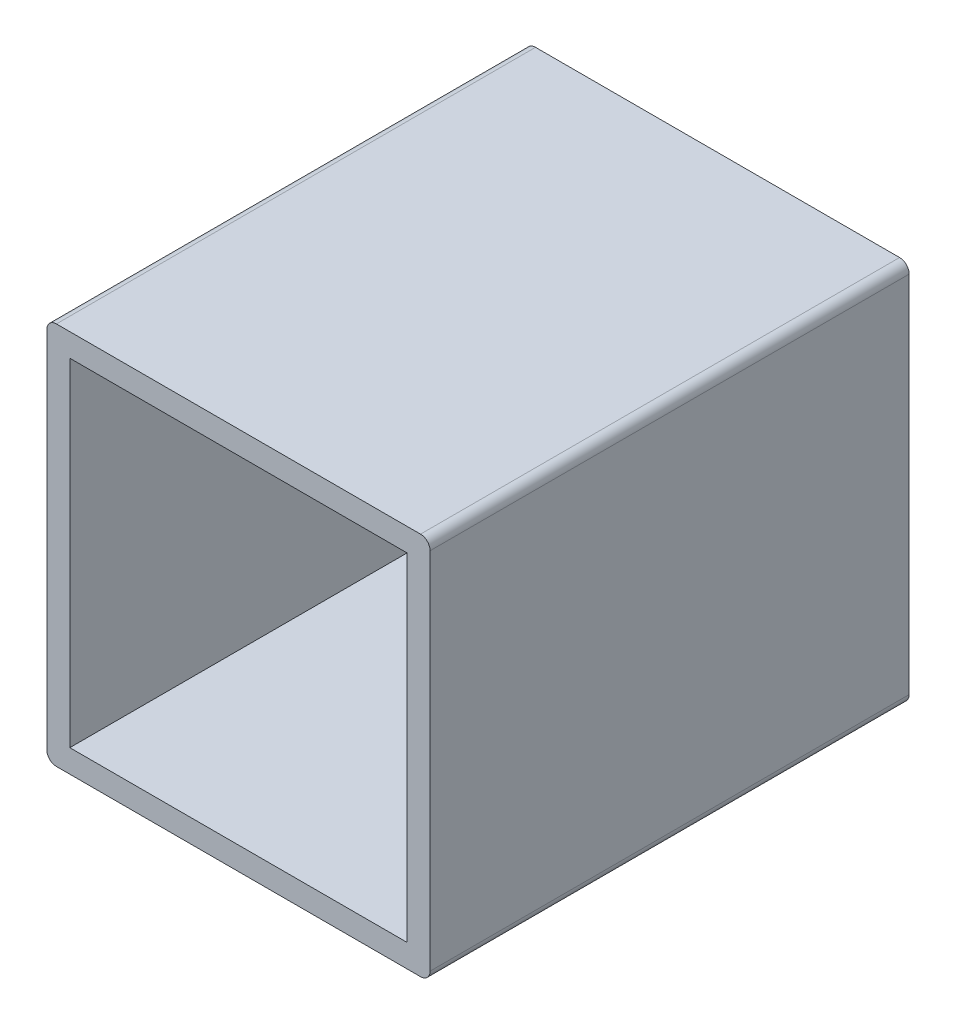
ISO-10303-21;
HEADER;
FILE_DESCRIPTION(('STEP AP214'),'2;1');
FILE_NAME('part.step','',(''),(''),'','','');
FILE_SCHEMA(('AUTOMOTIVE_DESIGN { 1 0 10303 214 1 1 1 1 }'));
ENDSEC;
DATA;
#1=APPLICATION_CONTEXT('core data for automotive mechanical design processes');
#2=APPLICATION_PROTOCOL_DEFINITION('international standard','automotive_design',2000,#1);
#3=PRODUCT_CONTEXT('',#1,'mechanical');
#4=PRODUCT('Part','Part','',(#3));
#5=PRODUCT_RELATED_PRODUCT_CATEGORY('part','',(#4));
#6=PRODUCT_DEFINITION_FORMATION('','',#4);
#7=PRODUCT_DEFINITION_CONTEXT('part definition',#1,'design');
#8=PRODUCT_DEFINITION('design','',#6,#7);
#9=PRODUCT_DEFINITION_SHAPE('','',#8);
#10=(LENGTH_UNIT() NAMED_UNIT(*) SI_UNIT(.MILLI.,.METRE.));
#11=(NAMED_UNIT(*) PLANE_ANGLE_UNIT() SI_UNIT($,.RADIAN.));
#12=(NAMED_UNIT(*) SI_UNIT($,.STERADIAN.) SOLID_ANGLE_UNIT());
#13=UNCERTAINTY_MEASURE_WITH_UNIT(LENGTH_MEASURE(1.E-05),#10,'distance_accuracy_value','');
#14=(GEOMETRIC_REPRESENTATION_CONTEXT(3) GLOBAL_UNCERTAINTY_ASSIGNED_CONTEXT((#13)) GLOBAL_UNIT_ASSIGNED_CONTEXT((#10,
#11,#12)) REPRESENTATION_CONTEXT('',''));
#15=CARTESIAN_POINT('',(0.,0.,0.));
#16=DIRECTION('',(0.,0.,1.));
#17=DIRECTION('',(1.,0.,0.));
#18=AXIS2_PLACEMENT_3D('',#15,#16,#17);
#19=CARTESIAN_POINT('',(-38.,-38.,-50.));
#20=DIRECTION('',(0.,0.,1.));
#21=DIRECTION('',(1.,0.,0.));
#22=AXIS2_PLACEMENT_3D('',#19,#20,#21);
#23=CYLINDRICAL_SURFACE('',#22,2.);
#24=CARTESIAN_POINT('',(-38.,-38.,50.));
#25=DIRECTION('',(0.,0.,1.));
#26=DIRECTION('',(1.,0.,0.));
#27=AXIS2_PLACEMENT_3D('',#24,#25,#26);
#28=CIRCLE('',#27,2.);
#29=CARTESIAN_POINT('',(-40.,-38.,50.));
#30=VERTEX_POINT('',#29);
#31=CARTESIAN_POINT('',(-38.,-40.,50.));
#32=VERTEX_POINT('',#31);
#33=EDGE_CURVE('E161',#30,#32,#28,.T.);
#34=ORIENTED_EDGE('',*,*,#33,.F.);
#35=DIRECTION('',(0.,0.,1.));
#36=VECTOR('',#35,1.);
#37=CARTESIAN_POINT('',(-40.,-38.,-50.));
#38=LINE('',#37,#36);
#39=CARTESIAN_POINT('',(-40.,-38.,-50.));
#40=VERTEX_POINT('',#39);
#41=EDGE_CURVE('E11',#40,#30,#38,.T.);
#42=ORIENTED_EDGE('',*,*,#41,.F.);
#43=CARTESIAN_POINT('',(-38.,-38.,-50.));
#44=DIRECTION('',(0.,0.,1.));
#45=DIRECTION('',(1.,0.,0.));
#46=AXIS2_PLACEMENT_3D('',#43,#44,#45);
#47=CIRCLE('',#46,2.);
#48=CARTESIAN_POINT('',(-38.,-40.,-50.));
#49=VERTEX_POINT('',#48);
#50=EDGE_CURVE('E165',#40,#49,#47,.T.);
#51=ORIENTED_EDGE('',*,*,#50,.T.);
#52=DIRECTION('',(0.,0.,1.));
#53=VECTOR('',#52,1.);
#54=CARTESIAN_POINT('',(-38.,-40.,-50.));
#55=LINE('',#54,#53);
#56=EDGE_CURVE('E42',#49,#32,#55,.T.);
#57=ORIENTED_EDGE('',*,*,#56,.T.);
#58=EDGE_LOOP('',(#34,#42,#51,#57));
#59=FACE_BOUND('',#58,.T.);
#60=ADVANCED_FACE('F39',(#59),#23,.T.);
#61=CARTESIAN_POINT('',(-40.,-38.,-50.));
#62=DIRECTION('',(-1.,0.,0.));
#63=DIRECTION('',(0.,0.,1.));
#64=AXIS2_PLACEMENT_3D('',#61,#62,#63);
#65=PLANE('',#64);
#66=DIRECTION('',(0.,-1.,0.));
#67=VECTOR('',#66,1.);
#68=CARTESIAN_POINT('',(-40.,-38.,50.));
#69=LINE('',#68,#67);
#70=CARTESIAN_POINT('',(-40.,38.,50.));
#71=VERTEX_POINT('',#70);
#72=EDGE_CURVE('E169',#71,#30,#69,.T.);
#73=ORIENTED_EDGE('',*,*,#72,.F.);
#74=DIRECTION('',(0.,0.,1.));
#75=VECTOR('',#74,1.);
#76=CARTESIAN_POINT('',(-40.,38.,-50.));
#77=LINE('',#76,#75);
#78=CARTESIAN_POINT('',(-40.,38.,-50.));
#79=VERTEX_POINT('',#78);
#80=EDGE_CURVE('E47',#79,#71,#77,.T.);
#81=ORIENTED_EDGE('',*,*,#80,.F.);
#82=DIRECTION('',(0.,-1.,0.));
#83=VECTOR('',#82,1.);
#84=CARTESIAN_POINT('',(-40.,-38.,-50.));
#85=LINE('',#84,#83);
#86=EDGE_CURVE('E187',#79,#40,#85,.T.);
#87=ORIENTED_EDGE('',*,*,#86,.T.);
#88=ORIENTED_EDGE('',*,*,#41,.T.);
#89=EDGE_LOOP('',(#73,#81,#87,#88));
#90=FACE_BOUND('',#89,.T.);
#91=ADVANCED_FACE('F234',(#90),#65,.T.);
#92=CARTESIAN_POINT('',(-38.,38.,-50.));
#93=DIRECTION('',(0.,0.,1.));
#94=DIRECTION('',(1.,0.,0.));
#95=AXIS2_PLACEMENT_3D('',#92,#93,#94);
#96=CYLINDRICAL_SURFACE('',#95,2.);
#97=CARTESIAN_POINT('',(-38.,38.,50.));
#98=DIRECTION('',(0.,0.,1.));
#99=DIRECTION('',(1.,0.,0.));
#100=AXIS2_PLACEMENT_3D('',#97,#98,#99);
#101=CIRCLE('',#100,2.);
#102=CARTESIAN_POINT('',(-38.,40.,50.));
#103=VERTEX_POINT('',#102);
#104=EDGE_CURVE('E207',#103,#71,#101,.T.);
#105=ORIENTED_EDGE('',*,*,#104,.F.);
#106=DIRECTION('',(0.,0.,1.));
#107=VECTOR('',#106,1.);
#108=CARTESIAN_POINT('',(-38.,40.,-50.));
#109=LINE('',#108,#107);
#110=CARTESIAN_POINT('',(-38.,40.,-50.));
#111=VERTEX_POINT('',#110);
#112=EDGE_CURVE('E213',#111,#103,#109,.T.);
#113=ORIENTED_EDGE('',*,*,#112,.F.);
#114=CARTESIAN_POINT('',(-38.,38.,-50.));
#115=DIRECTION('',(0.,0.,1.));
#116=DIRECTION('',(1.,0.,0.));
#117=AXIS2_PLACEMENT_3D('',#114,#115,#116);
#118=CIRCLE('',#117,2.);
#119=EDGE_CURVE('E184',#111,#79,#118,.T.);
#120=ORIENTED_EDGE('',*,*,#119,.T.);
#121=ORIENTED_EDGE('',*,*,#80,.T.);
#122=EDGE_LOOP('',(#105,#113,#120,#121));
#123=FACE_BOUND('',#122,.T.);
#124=ADVANCED_FACE('F253',(#123),#96,.T.);
#125=CARTESIAN_POINT('',(-38.,40.,-50.));
#126=DIRECTION('',(0.,1.,0.));
#127=DIRECTION('',(0.,0.,1.));
#128=AXIS2_PLACEMENT_3D('',#125,#126,#127);
#129=PLANE('',#128);
#130=DIRECTION('',(-1.,0.,0.));
#131=VECTOR('',#130,1.);
#132=CARTESIAN_POINT('',(-38.,40.,50.));
#133=LINE('',#132,#131);
#134=CARTESIAN_POINT('',(38.,40.,50.));
#135=VERTEX_POINT('',#134);
#136=EDGE_CURVE('E204',#135,#103,#133,.T.);
#137=ORIENTED_EDGE('',*,*,#136,.F.);
#138=DIRECTION('',(0.,0.,1.));
#139=VECTOR('',#138,1.);
#140=CARTESIAN_POINT('',(38.,40.,-50.));
#141=LINE('',#140,#139);
#142=CARTESIAN_POINT('',(38.,40.,-50.));
#143=VERTEX_POINT('',#142);
#144=EDGE_CURVE('E215',#143,#135,#141,.T.);
#145=ORIENTED_EDGE('',*,*,#144,.F.);
#146=DIRECTION('',(-1.,0.,0.));
#147=VECTOR('',#146,1.);
#148=CARTESIAN_POINT('',(-38.,40.,-50.));
#149=LINE('',#148,#147);
#150=EDGE_CURVE('E181',#143,#111,#149,.T.);
#151=ORIENTED_EDGE('',*,*,#150,.T.);
#152=ORIENTED_EDGE('',*,*,#112,.T.);
#153=EDGE_LOOP('',(#137,#145,#151,#152));
#154=FACE_BOUND('',#153,.T.);
#155=ADVANCED_FACE('F251',(#154),#129,.T.);
#156=CARTESIAN_POINT('',(38.,38.,-50.));
#157=DIRECTION('',(0.,0.,1.));
#158=DIRECTION('',(1.,0.,0.));
#159=AXIS2_PLACEMENT_3D('',#156,#157,#158);
#160=CYLINDRICAL_SURFACE('',#159,2.);
#161=CARTESIAN_POINT('',(38.,38.,50.));
#162=DIRECTION('',(0.,0.,1.));
#163=DIRECTION('',(-1.,0.,0.));
#164=AXIS2_PLACEMENT_3D('',#161,#162,#163);
#165=CIRCLE('',#164,2.);
#166=CARTESIAN_POINT('',(40.,38.,50.));
#167=VERTEX_POINT('',#166);
#168=EDGE_CURVE('E201',#167,#135,#165,.T.);
#169=ORIENTED_EDGE('',*,*,#168,.F.);
#170=DIRECTION('',(0.,0.,1.));
#171=VECTOR('',#170,1.);
#172=CARTESIAN_POINT('',(40.,38.,-50.));
#173=LINE('',#172,#171);
#174=CARTESIAN_POINT('',(40.,38.,-50.));
#175=VERTEX_POINT('',#174);
#176=EDGE_CURVE('E217',#175,#167,#173,.T.);
#177=ORIENTED_EDGE('',*,*,#176,.F.);
#178=CARTESIAN_POINT('',(38.,38.,-50.));
#179=DIRECTION('',(0.,0.,1.));
#180=DIRECTION('',(-1.,0.,0.));
#181=AXIS2_PLACEMENT_3D('',#178,#179,#180);
#182=CIRCLE('',#181,2.);
#183=EDGE_CURVE('E178',#175,#143,#182,.T.);
#184=ORIENTED_EDGE('',*,*,#183,.T.);
#185=ORIENTED_EDGE('',*,*,#144,.T.);
#186=EDGE_LOOP('',(#169,#177,#184,#185));
#187=FACE_BOUND('',#186,.T.);
#188=ADVANCED_FACE('F247',(#187),#160,.T.);
#189=CARTESIAN_POINT('',(40.,-38.,-50.));
#190=DIRECTION('',(1.,0.,0.));
#191=DIRECTION('',(0.,0.,-1.));
#192=AXIS2_PLACEMENT_3D('',#189,#190,#191);
#193=PLANE('',#192);
#194=DIRECTION('',(0.,1.,0.));
#195=VECTOR('',#194,1.);
#196=CARTESIAN_POINT('',(40.,-38.,50.));
#197=LINE('',#196,#195);
#198=CARTESIAN_POINT('',(40.,-38.,50.));
#199=VERTEX_POINT('',#198);
#200=EDGE_CURVE('E198',#199,#167,#197,.T.);
#201=ORIENTED_EDGE('',*,*,#200,.F.);
#202=DIRECTION('',(0.,0.,1.));
#203=VECTOR('',#202,1.);
#204=CARTESIAN_POINT('',(40.,-38.,-50.));
#205=LINE('',#204,#203);
#206=CARTESIAN_POINT('',(40.,-38.,-50.));
#207=VERTEX_POINT('',#206);
#208=EDGE_CURVE('E219',#207,#199,#205,.T.);
#209=ORIENTED_EDGE('',*,*,#208,.F.);
#210=DIRECTION('',(0.,1.,0.));
#211=VECTOR('',#210,1.);
#212=CARTESIAN_POINT('',(40.,-38.,-50.));
#213=LINE('',#212,#211);
#214=EDGE_CURVE('E175',#207,#175,#213,.T.);
#215=ORIENTED_EDGE('',*,*,#214,.T.);
#216=ORIENTED_EDGE('',*,*,#176,.T.);
#217=EDGE_LOOP('',(#201,#209,#215,#216));
#218=FACE_BOUND('',#217,.T.);
#219=ADVANCED_FACE('F245',(#218),#193,.T.);
#220=CARTESIAN_POINT('',(38.,-38.,-50.));
#221=DIRECTION('',(0.,0.,1.));
#222=DIRECTION('',(1.,0.,0.));
#223=AXIS2_PLACEMENT_3D('',#220,#221,#222);
#224=CYLINDRICAL_SURFACE('',#223,2.);
#225=CARTESIAN_POINT('',(38.,-38.,50.));
#226=DIRECTION('',(0.,0.,1.));
#227=DIRECTION('',(1.,0.,0.));
#228=AXIS2_PLACEMENT_3D('',#225,#226,#227);
#229=CIRCLE('',#228,2.);
#230=CARTESIAN_POINT('',(38.,-40.,50.));
#231=VERTEX_POINT('',#230);
#232=EDGE_CURVE('E195',#231,#199,#229,.T.);
#233=ORIENTED_EDGE('',*,*,#232,.F.);
#234=DIRECTION('',(0.,0.,1.));
#235=VECTOR('',#234,1.);
#236=CARTESIAN_POINT('',(38.,-40.,-50.));
#237=LINE('',#236,#235);
#238=CARTESIAN_POINT('',(38.,-40.,-50.));
#239=VERTEX_POINT('',#238);
#240=EDGE_CURVE('E220',#239,#231,#237,.T.);
#241=ORIENTED_EDGE('',*,*,#240,.F.);
#242=CARTESIAN_POINT('',(38.,-38.,-50.));
#243=DIRECTION('',(0.,0.,1.));
#244=DIRECTION('',(1.,0.,0.));
#245=AXIS2_PLACEMENT_3D('',#242,#243,#244);
#246=CIRCLE('',#245,2.);
#247=EDGE_CURVE('E172',#239,#207,#246,.T.);
#248=ORIENTED_EDGE('',*,*,#247,.T.);
#249=ORIENTED_EDGE('',*,*,#208,.T.);
#250=EDGE_LOOP('',(#233,#241,#248,#249));
#251=FACE_BOUND('',#250,.T.);
#252=ADVANCED_FACE('F241',(#251),#224,.T.);
#253=CARTESIAN_POINT('',(-38.,-40.,-50.));
#254=DIRECTION('',(0.,-1.,0.));
#255=DIRECTION('',(0.,0.,-1.));
#256=AXIS2_PLACEMENT_3D('',#253,#254,#255);
#257=PLANE('',#256);
#258=DIRECTION('',(1.,0.,0.));
#259=VECTOR('',#258,1.);
#260=CARTESIAN_POINT('',(-38.,-40.,50.));
#261=LINE('',#260,#259);
#262=EDGE_CURVE('E192',#32,#231,#261,.T.);
#263=ORIENTED_EDGE('',*,*,#262,.F.);
#264=ORIENTED_EDGE('',*,*,#56,.F.);
#265=DIRECTION('',(1.,0.,0.));
#266=VECTOR('',#265,1.);
#267=CARTESIAN_POINT('',(-38.,-40.,-50.));
#268=LINE('',#267,#266);
#269=EDGE_CURVE('E168',#49,#239,#268,.T.);
#270=ORIENTED_EDGE('',*,*,#269,.T.);
#271=ORIENTED_EDGE('',*,*,#240,.T.);
#272=EDGE_LOOP('',(#263,#264,#270,#271));
#273=FACE_BOUND('',#272,.T.);
#274=ADVANCED_FACE('F228',(#273),#257,.T.);
#275=CARTESIAN_POINT('',(-38.,-38.,-50.));
#276=DIRECTION('',(0.,0.,1.));
#277=DIRECTION('',(1.,0.,0.));
#278=AXIS2_PLACEMENT_3D('',#275,#276,#277);
#279=PLANE('',#278);
#280=DIRECTION('',(-1.,0.,0.));
#281=VECTOR('',#280,1.);
#282=CARTESIAN_POINT('',(-35.2,35.2,-50.));
#283=LINE('',#282,#281);
#284=CARTESIAN_POINT('',(35.2,35.2,-50.));
#285=VERTEX_POINT('',#284);
#286=CARTESIAN_POINT('',(-35.2,35.2,-50.));
#287=VERTEX_POINT('',#286);
#288=EDGE_CURVE('E136',#285,#287,#283,.T.);
#289=ORIENTED_EDGE('',*,*,#288,.T.);
#290=DIRECTION('',(0.,-1.,0.));
#291=VECTOR('',#290,1.);
#292=CARTESIAN_POINT('',(-35.2,-35.2,-50.));
#293=LINE('',#292,#291);
#294=CARTESIAN_POINT('',(-35.2,-35.2,-50.));
#295=VERTEX_POINT('',#294);
#296=EDGE_CURVE('E130',#287,#295,#293,.T.);
#297=ORIENTED_EDGE('',*,*,#296,.T.);
#298=DIRECTION('',(1.,0.,0.));
#299=VECTOR('',#298,1.);
#300=CARTESIAN_POINT('',(-35.2,-35.2,-50.));
#301=LINE('',#300,#299);
#302=CARTESIAN_POINT('',(35.2,-35.2,-50.));
#303=VERTEX_POINT('',#302);
#304=EDGE_CURVE('E139',#295,#303,#301,.T.);
#305=ORIENTED_EDGE('',*,*,#304,.T.);
#306=DIRECTION('',(0.,1.,0.));
#307=VECTOR('',#306,1.);
#308=CARTESIAN_POINT('',(35.2,-35.2,-50.));
#309=LINE('',#308,#307);
#310=EDGE_CURVE('E55',#303,#285,#309,.T.);
#311=ORIENTED_EDGE('',*,*,#310,.T.);
#312=EDGE_LOOP('',(#289,#297,#305,#311));
#313=FACE_BOUND('',#312,.T.);
#314=ORIENTED_EDGE('',*,*,#50,.F.);
#315=ORIENTED_EDGE('',*,*,#86,.F.);
#316=ORIENTED_EDGE('',*,*,#119,.F.);
#317=ORIENTED_EDGE('',*,*,#150,.F.);
#318=ORIENTED_EDGE('',*,*,#183,.F.);
#319=ORIENTED_EDGE('',*,*,#214,.F.);
#320=ORIENTED_EDGE('',*,*,#247,.F.);
#321=ORIENTED_EDGE('',*,*,#269,.F.);
#322=EDGE_LOOP('',(#314,#315,#316,#317,#318,#319,#320,#321));
#323=FACE_BOUND('',#322,.T.);
#324=ADVANCED_FACE('F143',(#313,#323),#279,.F.);
#325=CARTESIAN_POINT('',(-38.,-38.,50.));
#326=DIRECTION('',(0.,0.,1.));
#327=DIRECTION('',(1.,0.,0.));
#328=AXIS2_PLACEMENT_3D('',#325,#326,#327);
#329=PLANE('',#328);
#330=DIRECTION('',(0.,-1.,0.));
#331=VECTOR('',#330,1.);
#332=CARTESIAN_POINT('',(-35.2,-35.2,50.));
#333=LINE('',#332,#331);
#334=CARTESIAN_POINT('',(-35.2,35.2,50.));
#335=VERTEX_POINT('',#334);
#336=CARTESIAN_POINT('',(-35.2,-35.2,50.));
#337=VERTEX_POINT('',#336);
#338=EDGE_CURVE('E63',#335,#337,#333,.T.);
#339=ORIENTED_EDGE('',*,*,#338,.F.);
#340=DIRECTION('',(-1.,0.,0.));
#341=VECTOR('',#340,1.);
#342=CARTESIAN_POINT('',(-35.2,35.2,50.));
#343=LINE('',#342,#341);
#344=CARTESIAN_POINT('',(35.2,35.2,50.));
#345=VERTEX_POINT('',#344);
#346=EDGE_CURVE('E146',#345,#335,#343,.T.);
#347=ORIENTED_EDGE('',*,*,#346,.F.);
#348=DIRECTION('',(0.,1.,0.));
#349=VECTOR('',#348,1.);
#350=CARTESIAN_POINT('',(35.2,-35.2,50.));
#351=LINE('',#350,#349);
#352=CARTESIAN_POINT('',(35.2,-35.2,50.));
#353=VERTEX_POINT('',#352);
#354=EDGE_CURVE('E149',#353,#345,#351,.T.);
#355=ORIENTED_EDGE('',*,*,#354,.F.);
#356=DIRECTION('',(1.,0.,0.));
#357=VECTOR('',#356,1.);
#358=CARTESIAN_POINT('',(-35.2,-35.2,50.));
#359=LINE('',#358,#357);
#360=EDGE_CURVE('E155',#337,#353,#359,.T.);
#361=ORIENTED_EDGE('',*,*,#360,.F.);
#362=EDGE_LOOP('',(#339,#347,#355,#361));
#363=FACE_BOUND('',#362,.T.);
#364=ORIENTED_EDGE('',*,*,#33,.T.);
#365=ORIENTED_EDGE('',*,*,#262,.T.);
#366=ORIENTED_EDGE('',*,*,#232,.T.);
#367=ORIENTED_EDGE('',*,*,#200,.T.);
#368=ORIENTED_EDGE('',*,*,#168,.T.);
#369=ORIENTED_EDGE('',*,*,#136,.T.);
#370=ORIENTED_EDGE('',*,*,#104,.T.);
#371=ORIENTED_EDGE('',*,*,#72,.T.);
#372=EDGE_LOOP('',(#364,#365,#366,#367,#368,#369,#370,#371));
#373=FACE_BOUND('',#372,.T.);
#374=ADVANCED_FACE('F230',(#363,#373),#329,.T.);
#375=CARTESIAN_POINT('',(-35.2,-35.2,-50.));
#376=DIRECTION('',(-1.,0.,0.));
#377=DIRECTION('',(0.,0.,1.));
#378=AXIS2_PLACEMENT_3D('',#375,#376,#377);
#379=PLANE('',#378);
#380=ORIENTED_EDGE('',*,*,#338,.T.);
#381=DIRECTION('',(0.,0.,1.));
#382=VECTOR('',#381,1.);
#383=CARTESIAN_POINT('',(-35.2,-35.2,-50.));
#384=LINE('',#383,#382);
#385=EDGE_CURVE('E126',#295,#337,#384,.T.);
#386=ORIENTED_EDGE('',*,*,#385,.F.);
#387=ORIENTED_EDGE('',*,*,#296,.F.);
#388=DIRECTION('',(0.,0.,1.));
#389=VECTOR('',#388,1.);
#390=CARTESIAN_POINT('',(-35.2,35.2,-50.));
#391=LINE('',#390,#389);
#392=EDGE_CURVE('E159',#287,#335,#391,.T.);
#393=ORIENTED_EDGE('',*,*,#392,.T.);
#394=EDGE_LOOP('',(#380,#386,#387,#393));
#395=FACE_BOUND('',#394,.T.);
#396=ADVANCED_FACE('F128',(#395),#379,.F.);
#397=CARTESIAN_POINT('',(-35.2,35.2,-50.));
#398=DIRECTION('',(0.,1.,0.));
#399=DIRECTION('',(0.,0.,1.));
#400=AXIS2_PLACEMENT_3D('',#397,#398,#399);
#401=PLANE('',#400);
#402=ORIENTED_EDGE('',*,*,#346,.T.);
#403=ORIENTED_EDGE('',*,*,#392,.F.);
#404=ORIENTED_EDGE('',*,*,#288,.F.);
#405=DIRECTION('',(0.,0.,1.));
#406=VECTOR('',#405,1.);
#407=CARTESIAN_POINT('',(35.2,35.2,-50.));
#408=LINE('',#407,#406);
#409=EDGE_CURVE('E162',#285,#345,#408,.T.);
#410=ORIENTED_EDGE('',*,*,#409,.T.);
#411=EDGE_LOOP('',(#402,#403,#404,#410));
#412=FACE_BOUND('',#411,.T.);
#413=ADVANCED_FACE('F338',(#412),#401,.F.);
#414=CARTESIAN_POINT('',(35.2,-35.2,-50.));
#415=DIRECTION('',(1.,0.,0.));
#416=DIRECTION('',(0.,0.,-1.));
#417=AXIS2_PLACEMENT_3D('',#414,#415,#416);
#418=PLANE('',#417);
#419=ORIENTED_EDGE('',*,*,#354,.T.);
#420=ORIENTED_EDGE('',*,*,#409,.F.);
#421=ORIENTED_EDGE('',*,*,#310,.F.);
#422=DIRECTION('',(0.,0.,1.));
#423=VECTOR('',#422,1.);
#424=CARTESIAN_POINT('',(35.2,-35.2,-50.));
#425=LINE('',#424,#423);
#426=EDGE_CURVE('E135',#303,#353,#425,.T.);
#427=ORIENTED_EDGE('',*,*,#426,.T.);
#428=EDGE_LOOP('',(#419,#420,#421,#427));
#429=FACE_BOUND('',#428,.T.);
#430=ADVANCED_FACE('F347',(#429),#418,.F.);
#431=CARTESIAN_POINT('',(-35.2,-35.2,-50.));
#432=DIRECTION('',(0.,-1.,0.));
#433=DIRECTION('',(0.,0.,-1.));
#434=AXIS2_PLACEMENT_3D('',#431,#432,#433);
#435=PLANE('',#434);
#436=ORIENTED_EDGE('',*,*,#360,.T.);
#437=ORIENTED_EDGE('',*,*,#426,.F.);
#438=ORIENTED_EDGE('',*,*,#304,.F.);
#439=ORIENTED_EDGE('',*,*,#385,.T.);
#440=EDGE_LOOP('',(#436,#437,#438,#439));
#441=FACE_BOUND('',#440,.T.);
#442=ADVANCED_FACE('F140',(#441),#435,.F.);
#443=CLOSED_SHELL('',(#60,#91,#124,#155,#188,#219,#252,#274,#324,#374,#396,#413,#430,#442));
#444=MANIFOLD_SOLID_BREP('B2',#443);
#445=ADVANCED_BREP_SHAPE_REPRESENTATION('',(#18,#444),#14);
#446=SHAPE_DEFINITION_REPRESENTATION(#9,#445);
ENDSEC;
END-ISO-10303-21;
